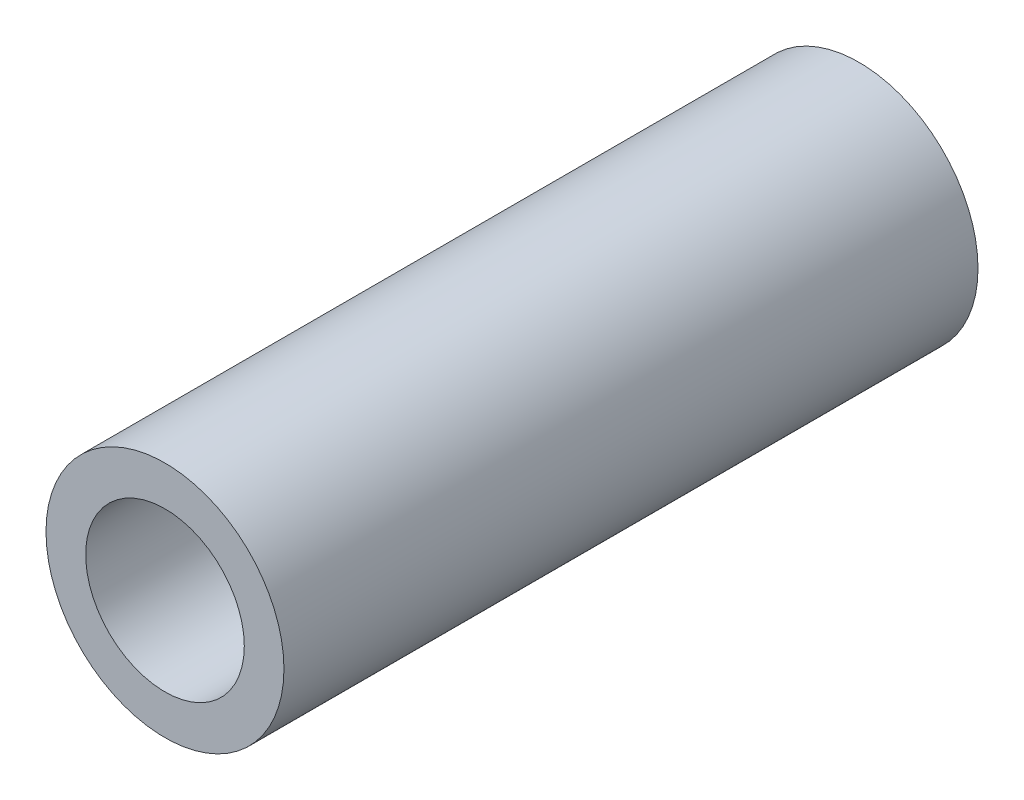
ISO-10303-21;
HEADER;
FILE_DESCRIPTION(('STEP AP214'),'2;1');
FILE_NAME('part.step','',(''),(''),'','','');
FILE_SCHEMA(('AUTOMOTIVE_DESIGN { 1 0 10303 214 1 1 1 1 }'));
ENDSEC;
DATA;
#1=APPLICATION_CONTEXT('core data for automotive mechanical design processes');
#2=APPLICATION_PROTOCOL_DEFINITION('international standard','automotive_design',2000,#1);
#3=PRODUCT_CONTEXT('',#1,'mechanical');
#4=PRODUCT('Part','Part','',(#3));
#5=PRODUCT_RELATED_PRODUCT_CATEGORY('part','',(#4));
#6=PRODUCT_DEFINITION_FORMATION('','',#4);
#7=PRODUCT_DEFINITION_CONTEXT('part definition',#1,'design');
#8=PRODUCT_DEFINITION('design','',#6,#7);
#9=PRODUCT_DEFINITION_SHAPE('','',#8);
#10=(LENGTH_UNIT() NAMED_UNIT(*) SI_UNIT(.MILLI.,.METRE.));
#11=(NAMED_UNIT(*) PLANE_ANGLE_UNIT() SI_UNIT($,.RADIAN.));
#12=(NAMED_UNIT(*) SI_UNIT($,.STERADIAN.) SOLID_ANGLE_UNIT());
#13=UNCERTAINTY_MEASURE_WITH_UNIT(LENGTH_MEASURE(1.E-05),#10,'distance_accuracy_value','');
#14=(GEOMETRIC_REPRESENTATION_CONTEXT(3) GLOBAL_UNCERTAINTY_ASSIGNED_CONTEXT((#13)) GLOBAL_UNIT_ASSIGNED_CONTEXT((#10,
#11,#12)) REPRESENTATION_CONTEXT('',''));
#15=CARTESIAN_POINT('',(0.,0.,0.));
#16=DIRECTION('',(0.,0.,1.));
#17=DIRECTION('',(1.,0.,0.));
#18=AXIS2_PLACEMENT_3D('',#15,#16,#17);
#19=CARTESIAN_POINT('',(0.,0.,33.));
#20=DIRECTION('',(0.,0.,1.));
#21=DIRECTION('',(1.,0.,0.));
#22=AXIS2_PLACEMENT_3D('',#19,#20,#21);
#23=PLANE('',#22);
#24=CARTESIAN_POINT('',(0.,0.,33.));
#25=DIRECTION('',(0.,0.,1.));
#26=DIRECTION('',(1.,0.,0.));
#27=AXIS2_PLACEMENT_3D('',#24,#25,#26);
#28=CIRCLE('',#27,6.);
#29=CARTESIAN_POINT('',(6.,0.,33.));
#30=VERTEX_POINT('',#29);
#31=EDGE_CURVE('E10',#30,#30,#28,.T.);
#32=ORIENTED_EDGE('',*,*,#31,.T.);
#33=EDGE_LOOP('',(#32));
#34=FACE_BOUND('',#33,.T.);
#35=CARTESIAN_POINT('',(0.,0.,33.));
#36=DIRECTION('',(0.,0.,1.));
#37=DIRECTION('',(1.,0.,0.));
#38=AXIS2_PLACEMENT_3D('',#35,#36,#37);
#39=CIRCLE('',#38,4.);
#40=CARTESIAN_POINT('',(4.,0.,33.));
#41=VERTEX_POINT('',#40);
#42=EDGE_CURVE('E48',#41,#41,#39,.T.);
#43=ORIENTED_EDGE('',*,*,#42,.F.);
#44=EDGE_LOOP('',(#43));
#45=FACE_BOUND('',#44,.T.);
#46=ADVANCED_FACE('F41',(#34,#45),#23,.T.);
#47=CARTESIAN_POINT('',(0.,0.,33.));
#48=DIRECTION('',(0.,0.,-1.));
#49=DIRECTION('',(-1.,0.,0.));
#50=AXIS2_PLACEMENT_3D('',#47,#48,#49);
#51=CYLINDRICAL_SURFACE('',#50,6.);
#52=ORIENTED_EDGE('',*,*,#31,.F.);
#53=EDGE_LOOP('',(#52));
#54=FACE_BOUND('',#53,.T.);
#55=CARTESIAN_POINT('',(0.,0.,-2.));
#56=DIRECTION('',(0.,0.,1.));
#57=DIRECTION('',(1.,0.,0.));
#58=AXIS2_PLACEMENT_3D('',#55,#56,#57);
#59=CIRCLE('',#58,6.);
#60=CARTESIAN_POINT('',(6.,0.,-2.));
#61=VERTEX_POINT('',#60);
#62=EDGE_CURVE('E57',#61,#61,#59,.T.);
#63=ORIENTED_EDGE('',*,*,#62,.T.);
#64=EDGE_LOOP('',(#63));
#65=FACE_BOUND('',#64,.T.);
#66=ADVANCED_FACE('F43',(#54,#65),#51,.T.);
#67=CARTESIAN_POINT('',(0.,0.,33.));
#68=DIRECTION('',(0.,0.,-1.));
#69=DIRECTION('',(-1.,0.,0.));
#70=AXIS2_PLACEMENT_3D('',#67,#68,#69);
#71=CYLINDRICAL_SURFACE('',#70,4.);
#72=ORIENTED_EDGE('',*,*,#42,.T.);
#73=EDGE_LOOP('',(#72));
#74=FACE_BOUND('',#73,.T.);
#75=CARTESIAN_POINT('',(0.,0.,0.));
#76=DIRECTION('',(0.,0.,1.));
#77=DIRECTION('',(1.,0.,0.));
#78=AXIS2_PLACEMENT_3D('',#75,#76,#77);
#79=CIRCLE('',#78,4.);
#80=CARTESIAN_POINT('',(4.,0.,0.));
#81=VERTEX_POINT('',#80);
#82=EDGE_CURVE('E52',#81,#81,#79,.T.);
#83=ORIENTED_EDGE('',*,*,#82,.F.);
#84=EDGE_LOOP('',(#83));
#85=FACE_BOUND('',#84,.T.);
#86=ADVANCED_FACE('F70',(#74,#85),#71,.F.);
#87=CARTESIAN_POINT('',(0.,0.,0.));
#88=DIRECTION('',(0.,0.,1.));
#89=DIRECTION('',(1.,0.,0.));
#90=AXIS2_PLACEMENT_3D('',#87,#88,#89);
#91=PLANE('',#90);
#92=ORIENTED_EDGE('',*,*,#82,.T.);
#93=EDGE_LOOP('',(#92));
#94=FACE_BOUND('',#93,.T.);
#95=ADVANCED_FACE('F65',(#94),#91,.T.);
#96=CARTESIAN_POINT('',(0.,0.,-2.));
#97=DIRECTION('',(0.,0.,1.));
#98=DIRECTION('',(1.,0.,0.));
#99=AXIS2_PLACEMENT_3D('',#96,#97,#98);
#100=PLANE('',#99);
#101=ORIENTED_EDGE('',*,*,#62,.F.);
#102=EDGE_LOOP('',(#101));
#103=FACE_BOUND('',#102,.T.);
#104=ADVANCED_FACE('F63',(#103),#100,.F.);
#105=CLOSED_SHELL('',(#46,#66,#86,#95,#104));
#106=MANIFOLD_SOLID_BREP('B2',#105);
#107=ADVANCED_BREP_SHAPE_REPRESENTATION('',(#18,#106),#14);
#108=SHAPE_DEFINITION_REPRESENTATION(#9,#107);
ENDSEC;
END-ISO-10303-21;
